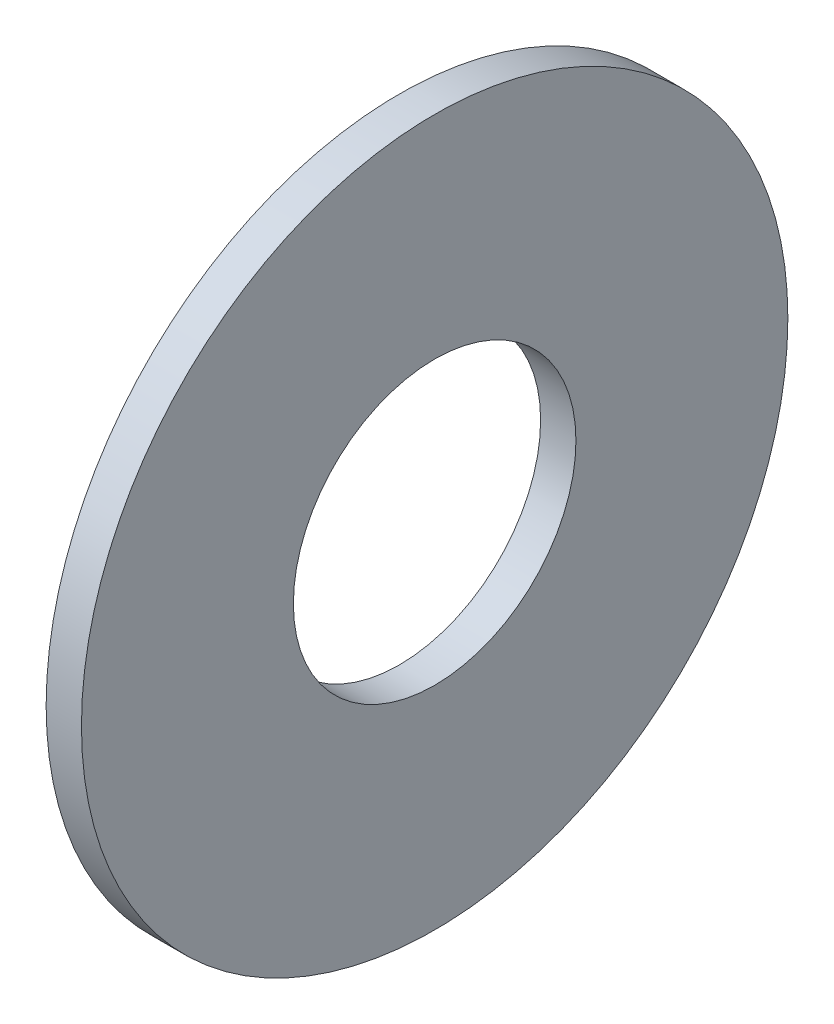
ISO-10303-21;
HEADER;
FILE_DESCRIPTION(('STEP AP214'),'2;1');
FILE_NAME('part.step','',(''),(''),'','','');
FILE_SCHEMA(('AUTOMOTIVE_DESIGN { 1 0 10303 214 1 1 1 1 }'));
ENDSEC;
DATA;
#1=APPLICATION_CONTEXT('core data for automotive mechanical design processes');
#2=APPLICATION_PROTOCOL_DEFINITION('international standard','automotive_design',2000,#1);
#3=PRODUCT_CONTEXT('',#1,'mechanical');
#4=PRODUCT('Part','Part','',(#3));
#5=PRODUCT_RELATED_PRODUCT_CATEGORY('part','',(#4));
#6=PRODUCT_DEFINITION_FORMATION('','',#4);
#7=PRODUCT_DEFINITION_CONTEXT('part definition',#1,'design');
#8=PRODUCT_DEFINITION('design','',#6,#7);
#9=PRODUCT_DEFINITION_SHAPE('','',#8);
#10=(LENGTH_UNIT() NAMED_UNIT(*) SI_UNIT(.MILLI.,.METRE.));
#11=(NAMED_UNIT(*) PLANE_ANGLE_UNIT() SI_UNIT($,.RADIAN.));
#12=(NAMED_UNIT(*) SI_UNIT($,.STERADIAN.) SOLID_ANGLE_UNIT());
#13=UNCERTAINTY_MEASURE_WITH_UNIT(LENGTH_MEASURE(1.E-05),#10,'distance_accuracy_value','');
#14=(GEOMETRIC_REPRESENTATION_CONTEXT(3) GLOBAL_UNCERTAINTY_ASSIGNED_CONTEXT((#13)) GLOBAL_UNIT_ASSIGNED_CONTEXT((#10,
#11,#12)) REPRESENTATION_CONTEXT('',''));
#15=CARTESIAN_POINT('',(0.,0.,0.));
#16=DIRECTION('',(0.,0.,1.));
#17=DIRECTION('',(1.,0.,0.));
#18=AXIS2_PLACEMENT_3D('',#15,#16,#17);
#19=CARTESIAN_POINT('',(1.,0.,0.));
#20=DIRECTION('',(1.,0.,0.));
#21=DIRECTION('',(0.,0.,-1.));
#22=AXIS2_PLACEMENT_3D('',#19,#20,#21);
#23=PLANE('',#22);
#24=CARTESIAN_POINT('',(1.,0.,0.));
#25=DIRECTION('',(1.,0.,0.));
#26=DIRECTION('',(0.,0.,-1.));
#27=AXIS2_PLACEMENT_3D('',#24,#25,#26);
#28=CIRCLE('',#27,10.);
#29=CARTESIAN_POINT('',(1.,0.,-10.));
#30=VERTEX_POINT('',#29);
#31=EDGE_CURVE('E10',#30,#30,#28,.T.);
#32=ORIENTED_EDGE('',*,*,#31,.T.);
#33=EDGE_LOOP('',(#32));
#34=FACE_BOUND('',#33,.T.);
#35=CARTESIAN_POINT('',(1.,0.,0.));
#36=DIRECTION('',(1.,0.,0.));
#37=DIRECTION('',(0.,0.,-1.));
#38=AXIS2_PLACEMENT_3D('',#35,#36,#37);
#39=CIRCLE('',#38,4.);
#40=CARTESIAN_POINT('',(1.,0.,-4.));
#41=VERTEX_POINT('',#40);
#42=EDGE_CURVE('E44',#41,#41,#39,.T.);
#43=ORIENTED_EDGE('',*,*,#42,.F.);
#44=EDGE_LOOP('',(#43));
#45=FACE_BOUND('',#44,.T.);
#46=ADVANCED_FACE('F33',(#34,#45),#23,.T.);
#47=CARTESIAN_POINT('',(0.,0.,0.));
#48=DIRECTION('',(1.,0.,0.));
#49=DIRECTION('',(0.,0.,-1.));
#50=AXIS2_PLACEMENT_3D('',#47,#48,#49);
#51=PLANE('',#50);
#52=CARTESIAN_POINT('',(0.,0.,0.));
#53=DIRECTION('',(1.,0.,0.));
#54=DIRECTION('',(0.,0.,-1.));
#55=AXIS2_PLACEMENT_3D('',#52,#53,#54);
#56=CIRCLE('',#55,10.);
#57=CARTESIAN_POINT('',(0.,0.,-10.));
#58=VERTEX_POINT('',#57);
#59=EDGE_CURVE('E37',#58,#58,#56,.T.);
#60=ORIENTED_EDGE('',*,*,#59,.F.);
#61=EDGE_LOOP('',(#60));
#62=FACE_BOUND('',#61,.T.);
#63=CARTESIAN_POINT('',(0.,0.,0.));
#64=DIRECTION('',(1.,0.,0.));
#65=DIRECTION('',(0.,0.,-1.));
#66=AXIS2_PLACEMENT_3D('',#63,#64,#65);
#67=CIRCLE('',#66,4.);
#68=CARTESIAN_POINT('',(0.,0.,-4.));
#69=VERTEX_POINT('',#68);
#70=EDGE_CURVE('E46',#69,#69,#67,.T.);
#71=ORIENTED_EDGE('',*,*,#70,.T.);
#72=EDGE_LOOP('',(#71));
#73=FACE_BOUND('',#72,.T.);
#74=ADVANCED_FACE('F56',(#62,#73),#51,.F.);
#75=CARTESIAN_POINT('',(1.,0.,0.));
#76=DIRECTION('',(-1.,0.,0.));
#77=DIRECTION('',(0.,0.,1.));
#78=AXIS2_PLACEMENT_3D('',#75,#76,#77);
#79=CYLINDRICAL_SURFACE('',#78,10.);
#80=ORIENTED_EDGE('',*,*,#31,.F.);
#81=EDGE_LOOP('',(#80));
#82=FACE_BOUND('',#81,.T.);
#83=ORIENTED_EDGE('',*,*,#59,.T.);
#84=EDGE_LOOP('',(#83));
#85=FACE_BOUND('',#84,.T.);
#86=ADVANCED_FACE('F35',(#82,#85),#79,.T.);
#87=CARTESIAN_POINT('',(1.,0.,0.));
#88=DIRECTION('',(-1.,0.,0.));
#89=DIRECTION('',(0.,0.,1.));
#90=AXIS2_PLACEMENT_3D('',#87,#88,#89);
#91=CYLINDRICAL_SURFACE('',#90,4.);
#92=ORIENTED_EDGE('',*,*,#42,.T.);
#93=EDGE_LOOP('',(#92));
#94=FACE_BOUND('',#93,.T.);
#95=ORIENTED_EDGE('',*,*,#70,.F.);
#96=EDGE_LOOP('',(#95));
#97=FACE_BOUND('',#96,.T.);
#98=ADVANCED_FACE('F52',(#94,#97),#91,.F.);
#99=CLOSED_SHELL('',(#46,#74,#86,#98));
#100=MANIFOLD_SOLID_BREP('B2',#99);
#101=ADVANCED_BREP_SHAPE_REPRESENTATION('',(#18,#100),#14);
#102=SHAPE_DEFINITION_REPRESENTATION(#9,#101);
ENDSEC;
END-ISO-10303-21;
